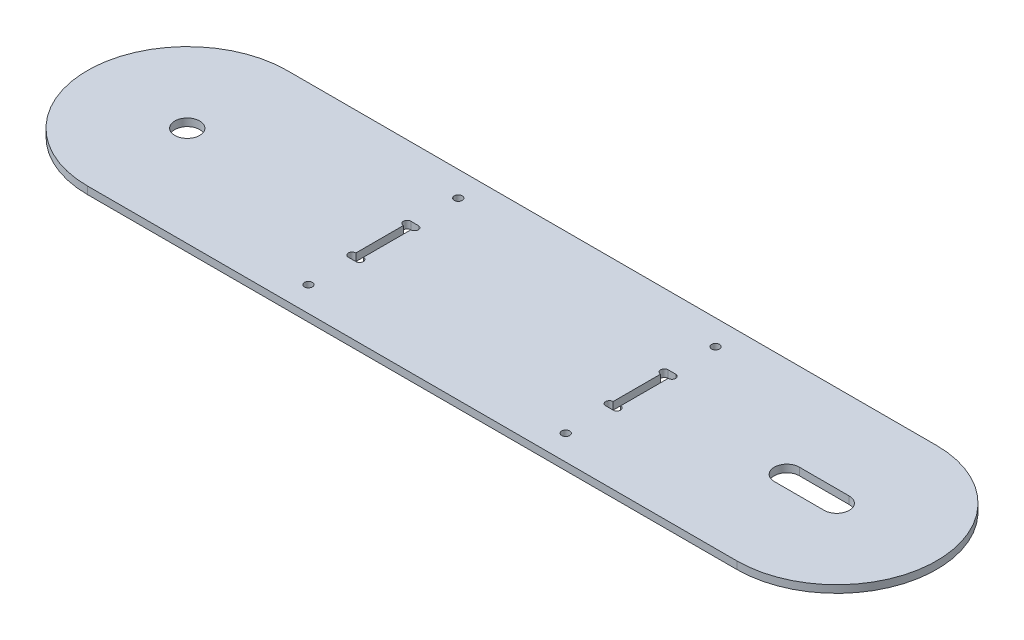
ISO-10303-21;
HEADER;
FILE_DESCRIPTION(('STEP AP214'),'2;1');
FILE_NAME('part.step','',(''),(''),'','','');
FILE_SCHEMA(('AUTOMOTIVE_DESIGN { 1 0 10303 214 1 1 1 1 }'));
ENDSEC;
DATA;
#1=APPLICATION_CONTEXT('core data for automotive mechanical design processes');
#2=APPLICATION_PROTOCOL_DEFINITION('international standard','automotive_design',2000,#1);
#3=PRODUCT_CONTEXT('',#1,'mechanical');
#4=PRODUCT('Part','Part','',(#3));
#5=PRODUCT_RELATED_PRODUCT_CATEGORY('part','',(#4));
#6=PRODUCT_DEFINITION_FORMATION('','',#4);
#7=PRODUCT_DEFINITION_CONTEXT('part definition',#1,'design');
#8=PRODUCT_DEFINITION('design','',#6,#7);
#9=PRODUCT_DEFINITION_SHAPE('','',#8);
#10=(LENGTH_UNIT() NAMED_UNIT(*) SI_UNIT(.MILLI.,.METRE.));
#11=(NAMED_UNIT(*) PLANE_ANGLE_UNIT() SI_UNIT($,.RADIAN.));
#12=(NAMED_UNIT(*) SI_UNIT($,.STERADIAN.) SOLID_ANGLE_UNIT());
#13=UNCERTAINTY_MEASURE_WITH_UNIT(LENGTH_MEASURE(1.E-05),#10,'distance_accuracy_value','');
#14=(GEOMETRIC_REPRESENTATION_CONTEXT(3) GLOBAL_UNCERTAINTY_ASSIGNED_CONTEXT((#13)) GLOBAL_UNIT_ASSIGNED_CONTEXT((#10,
#11,#12)) REPRESENTATION_CONTEXT('',''));
#15=CARTESIAN_POINT('',(0.,0.,0.));
#16=DIRECTION('',(0.,0.,1.));
#17=DIRECTION('',(1.,0.,0.));
#18=AXIS2_PLACEMENT_3D('',#15,#16,#17);
#19=CARTESIAN_POINT('',(0.,3.,0.));
#20=DIRECTION('',(0.,1.,0.));
#21=DIRECTION('',(0.,0.,1.));
#22=AXIS2_PLACEMENT_3D('',#19,#20,#21);
#23=PLANE('',#22);
#24=CARTESIAN_POINT('',(181.5,3.,-30.));
#25=DIRECTION('',(0.,1.,0.));
#26=DIRECTION('',(0.,0.,-1.));
#27=AXIS2_PLACEMENT_3D('',#24,#25,#26);
#28=CIRCLE('',#27,1.59999999999999);
#29=CARTESIAN_POINT('',(181.5,3.,-31.5999999999999));
#30=VERTEX_POINT('',#29);
#31=EDGE_CURVE('E277',#30,#30,#28,.T.);
#32=ORIENTED_EDGE('',*,*,#31,.F.);
#33=EDGE_LOOP('',(#32));
#34=FACE_BOUND('',#33,.T.);
#35=CARTESIAN_POINT('',(180.,3.,-11.));
#36=DIRECTION('',(0.,1.,0.));
#37=DIRECTION('',(0.,0.,-1.));
#38=AXIS2_PLACEMENT_3D('',#35,#36,#37);
#39=CIRCLE('',#38,1.5);
#40=CARTESIAN_POINT('',(180.,3.,-12.5));
#41=VERTEX_POINT('',#40);
#42=CARTESIAN_POINT('',(180.,3.,-9.5));
#43=VERTEX_POINT('',#42);
#44=EDGE_CURVE('E56',#41,#43,#39,.T.);
#45=ORIENTED_EDGE('',*,*,#44,.F.);
#46=DIRECTION('',(-1.,0.,0.));
#47=VECTOR('',#46,1.);
#48=CARTESIAN_POINT('',(183.,3.,-12.5));
#49=LINE('',#48,#47);
#50=CARTESIAN_POINT('',(183.,3.,-12.5));
#51=VERTEX_POINT('',#50);
#52=EDGE_CURVE('E278',#51,#41,#49,.T.);
#53=ORIENTED_EDGE('',*,*,#52,.F.);
#54=CARTESIAN_POINT('',(183.,3.,-11.));
#55=DIRECTION('',(0.,1.,0.));
#56=DIRECTION('',(0.,0.,-1.));
#57=AXIS2_PLACEMENT_3D('',#54,#55,#56);
#58=CIRCLE('',#57,1.5);
#59=CARTESIAN_POINT('',(183.,3.,-9.5));
#60=VERTEX_POINT('',#59);
#61=EDGE_CURVE('E281',#60,#51,#58,.T.);
#62=ORIENTED_EDGE('',*,*,#61,.F.);
#63=DIRECTION('',(0.,0.,-1.));
#64=VECTOR('',#63,1.);
#65=CARTESIAN_POINT('',(183.,3.,-9.5));
#66=LINE('',#65,#64);
#67=CARTESIAN_POINT('',(183.,3.,9.5));
#68=VERTEX_POINT('',#67);
#69=EDGE_CURVE('E285',#68,#60,#66,.T.);
#70=ORIENTED_EDGE('',*,*,#69,.F.);
#71=CARTESIAN_POINT('',(183.,3.,11.));
#72=DIRECTION('',(0.,1.,0.));
#73=DIRECTION('',(0.,0.,-1.));
#74=AXIS2_PLACEMENT_3D('',#71,#72,#73);
#75=CIRCLE('',#74,1.5);
#76=CARTESIAN_POINT('',(183.,3.,12.5));
#77=VERTEX_POINT('',#76);
#78=EDGE_CURVE('E288',#77,#68,#75,.T.);
#79=ORIENTED_EDGE('',*,*,#78,.F.);
#80=DIRECTION('',(1.,0.,0.));
#81=VECTOR('',#80,1.);
#82=CARTESIAN_POINT('',(183.,3.,12.5));
#83=LINE('',#82,#81);
#84=CARTESIAN_POINT('',(180.,3.,12.5));
#85=VERTEX_POINT('',#84);
#86=EDGE_CURVE('E291',#85,#77,#83,.T.);
#87=ORIENTED_EDGE('',*,*,#86,.F.);
#88=CARTESIAN_POINT('',(180.,3.,11.));
#89=DIRECTION('',(0.,1.,0.));
#90=DIRECTION('',(0.,0.,-1.));
#91=AXIS2_PLACEMENT_3D('',#88,#89,#90);
#92=CIRCLE('',#91,1.5);
#93=CARTESIAN_POINT('',(180.,3.,9.5));
#94=VERTEX_POINT('',#93);
#95=EDGE_CURVE('E294',#94,#85,#92,.T.);
#96=ORIENTED_EDGE('',*,*,#95,.F.);
#97=DIRECTION('',(0.,0.,1.));
#98=VECTOR('',#97,1.);
#99=CARTESIAN_POINT('',(180.,3.,-9.5));
#100=LINE('',#99,#98);
#101=EDGE_CURVE('E297',#43,#94,#100,.T.);
#102=ORIENTED_EDGE('',*,*,#101,.F.);
#103=EDGE_LOOP('',(#45,#53,#62,#70,#79,#87,#96,#102));
#104=FACE_BOUND('',#103,.T.);
#105=CARTESIAN_POINT('',(181.5,3.,30.));
#106=DIRECTION('',(0.,1.,0.));
#107=DIRECTION('',(0.,0.,-1.));
#108=AXIS2_PLACEMENT_3D('',#105,#106,#107);
#109=CIRCLE('',#108,1.59999999999999);
#110=CARTESIAN_POINT('',(181.5,3.,28.4));
#111=VERTEX_POINT('',#110);
#112=EDGE_CURVE('E209',#111,#111,#109,.T.);
#113=ORIENTED_EDGE('',*,*,#112,.F.);
#114=EDGE_LOOP('',(#113));
#115=FACE_BOUND('',#114,.T.);
#116=CARTESIAN_POINT('',(77.,3.,-11.));
#117=DIRECTION('',(0.,1.,0.));
#118=DIRECTION('',(0.,0.,1.));
#119=AXIS2_PLACEMENT_3D('',#116,#117,#118);
#120=CIRCLE('',#119,1.5);
#121=CARTESIAN_POINT('',(77.,3.,-12.5));
#122=VERTEX_POINT('',#121);
#123=CARTESIAN_POINT('',(77.,3.,-9.5));
#124=VERTEX_POINT('',#123);
#125=EDGE_CURVE('E64',#122,#124,#120,.T.);
#126=ORIENTED_EDGE('',*,*,#125,.F.);
#127=DIRECTION('',(-1.,0.,0.));
#128=VECTOR('',#127,1.);
#129=CARTESIAN_POINT('',(77.,3.,-12.5));
#130=LINE('',#129,#128);
#131=CARTESIAN_POINT('',(80.,3.,-12.5));
#132=VERTEX_POINT('',#131);
#133=EDGE_CURVE('E212',#132,#122,#130,.T.);
#134=ORIENTED_EDGE('',*,*,#133,.F.);
#135=CARTESIAN_POINT('',(80.,3.,-11.));
#136=DIRECTION('',(0.,1.,0.));
#137=DIRECTION('',(0.,0.,1.));
#138=AXIS2_PLACEMENT_3D('',#135,#136,#137);
#139=CIRCLE('',#138,1.5);
#140=CARTESIAN_POINT('',(80.,3.,-9.5));
#141=VERTEX_POINT('',#140);
#142=EDGE_CURVE('E217',#141,#132,#139,.T.);
#143=ORIENTED_EDGE('',*,*,#142,.F.);
#144=DIRECTION('',(0.,0.,-1.));
#145=VECTOR('',#144,1.);
#146=CARTESIAN_POINT('',(80.,3.,-9.5));
#147=LINE('',#146,#145);
#148=CARTESIAN_POINT('',(80.,3.,9.5));
#149=VERTEX_POINT('',#148);
#150=EDGE_CURVE('E820',#149,#141,#147,.T.);
#151=ORIENTED_EDGE('',*,*,#150,.F.);
#152=CARTESIAN_POINT('',(80.,3.,11.));
#153=DIRECTION('',(0.,1.,0.));
#154=DIRECTION('',(0.,0.,1.));
#155=AXIS2_PLACEMENT_3D('',#152,#153,#154);
#156=CIRCLE('',#155,1.5);
#157=CARTESIAN_POINT('',(80.,3.,12.5));
#158=VERTEX_POINT('',#157);
#159=EDGE_CURVE('E823',#158,#149,#156,.T.);
#160=ORIENTED_EDGE('',*,*,#159,.F.);
#161=DIRECTION('',(1.,0.,0.));
#162=VECTOR('',#161,1.);
#163=CARTESIAN_POINT('',(77.,3.,12.5));
#164=LINE('',#163,#162);
#165=CARTESIAN_POINT('',(77.,3.,12.5));
#166=VERTEX_POINT('',#165);
#167=EDGE_CURVE('E826',#166,#158,#164,.T.);
#168=ORIENTED_EDGE('',*,*,#167,.F.);
#169=CARTESIAN_POINT('',(77.,3.,11.));
#170=DIRECTION('',(0.,1.,0.));
#171=DIRECTION('',(0.,0.,1.));
#172=AXIS2_PLACEMENT_3D('',#169,#170,#171);
#173=CIRCLE('',#172,1.5);
#174=CARTESIAN_POINT('',(77.,3.,9.5));
#175=VERTEX_POINT('',#174);
#176=EDGE_CURVE('E229',#175,#166,#173,.T.);
#177=ORIENTED_EDGE('',*,*,#176,.F.);
#178=DIRECTION('',(0.,0.,1.));
#179=VECTOR('',#178,1.);
#180=CARTESIAN_POINT('',(77.,3.,-9.5));
#181=LINE('',#180,#179);
#182=EDGE_CURVE('E223',#124,#175,#181,.T.);
#183=ORIENTED_EDGE('',*,*,#182,.F.);
#184=EDGE_LOOP('',(#126,#134,#143,#151,#160,#168,#177,#183));
#185=FACE_BOUND('',#184,.T.);
#186=CARTESIAN_POINT('',(78.5,3.,30.));
#187=DIRECTION('',(0.,1.,0.));
#188=DIRECTION('',(0.,0.,1.));
#189=AXIS2_PLACEMENT_3D('',#186,#187,#188);
#190=CIRCLE('',#189,1.6);
#191=CARTESIAN_POINT('',(78.5,3.,31.6));
#192=VERTEX_POINT('',#191);
#193=EDGE_CURVE('E227',#192,#192,#190,.T.);
#194=ORIENTED_EDGE('',*,*,#193,.F.);
#195=EDGE_LOOP('',(#194));
#196=FACE_BOUND('',#195,.T.);
#197=CARTESIAN_POINT('',(78.5,3.,-30.));
#198=DIRECTION('',(0.,1.,0.));
#199=DIRECTION('',(0.,0.,1.));
#200=AXIS2_PLACEMENT_3D('',#197,#198,#199);
#201=CIRCLE('',#200,1.6);
#202=CARTESIAN_POINT('',(78.5,3.,-28.4));
#203=VERTEX_POINT('',#202);
#204=EDGE_CURVE('E332',#203,#203,#201,.T.);
#205=ORIENTED_EDGE('',*,*,#204,.F.);
#206=EDGE_LOOP('',(#205));
#207=FACE_BOUND('',#206,.T.);
#208=CARTESIAN_POINT('',(0.,3.,0.));
#209=DIRECTION('',(0.,1.,0.));
#210=DIRECTION('',(0.,0.,1.));
#211=AXIS2_PLACEMENT_3D('',#208,#209,#210);
#212=CIRCLE('',#211,40.);
#213=CARTESIAN_POINT('',(0.,3.,-40.));
#214=VERTEX_POINT('',#213);
#215=CARTESIAN_POINT('',(0.,3.,40.));
#216=VERTEX_POINT('',#215);
#217=EDGE_CURVE('E372',#214,#216,#212,.T.);
#218=ORIENTED_EDGE('',*,*,#217,.T.);
#219=DIRECTION('',(1.,0.,0.));
#220=VECTOR('',#219,1.);
#221=CARTESIAN_POINT('',(0.,3.,40.));
#222=LINE('',#221,#220);
#223=CARTESIAN_POINT('',(260.,3.,40.));
#224=VERTEX_POINT('',#223);
#225=EDGE_CURVE('E375',#216,#224,#222,.T.);
#226=ORIENTED_EDGE('',*,*,#225,.T.);
#227=CARTESIAN_POINT('',(260.,3.,0.));
#228=DIRECTION('',(0.,1.,0.));
#229=DIRECTION('',(0.,0.,1.));
#230=AXIS2_PLACEMENT_3D('',#227,#228,#229);
#231=CIRCLE('',#230,40.);
#232=CARTESIAN_POINT('',(260.,3.,-40.));
#233=VERTEX_POINT('',#232);
#234=EDGE_CURVE('E378',#224,#233,#231,.T.);
#235=ORIENTED_EDGE('',*,*,#234,.T.);
#236=DIRECTION('',(-1.,0.,0.));
#237=VECTOR('',#236,1.);
#238=CARTESIAN_POINT('',(0.,3.,-40.));
#239=LINE('',#238,#237);
#240=EDGE_CURVE('E380',#233,#214,#239,.T.);
#241=ORIENTED_EDGE('',*,*,#240,.T.);
#242=EDGE_LOOP('',(#218,#226,#235,#241));
#243=FACE_BOUND('',#242,.T.);
#244=CARTESIAN_POINT('',(0.,3.,0.));
#245=DIRECTION('',(0.,1.,0.));
#246=DIRECTION('',(0.,0.,1.));
#247=AXIS2_PLACEMENT_3D('',#244,#245,#246);
#248=CIRCLE('',#247,5.);
#249=CARTESIAN_POINT('',(0.,3.,5.));
#250=VERTEX_POINT('',#249);
#251=EDGE_CURVE('E366',#250,#250,#248,.T.);
#252=ORIENTED_EDGE('',*,*,#251,.F.);
#253=EDGE_LOOP('',(#252));
#254=FACE_BOUND('',#253,.T.);
#255=DIRECTION('',(-1.,0.,0.));
#256=VECTOR('',#255,1.);
#257=CARTESIAN_POINT('',(260.,3.,-5.));
#258=LINE('',#257,#256);
#259=CARTESIAN_POINT('',(260.,3.,-5.));
#260=VERTEX_POINT('',#259);
#261=CARTESIAN_POINT('',(240.,3.,-5.));
#262=VERTEX_POINT('',#261);
#263=EDGE_CURVE('E337',#260,#262,#258,.T.);
#264=ORIENTED_EDGE('',*,*,#263,.F.);
#265=CARTESIAN_POINT('',(260.,3.,0.));
#266=DIRECTION('',(0.,1.,0.));
#267=DIRECTION('',(0.,0.,1.));
#268=AXIS2_PLACEMENT_3D('',#265,#266,#267);
#269=CIRCLE('',#268,5.);
#270=CARTESIAN_POINT('',(260.,3.,5.));
#271=VERTEX_POINT('',#270);
#272=EDGE_CURVE('E335',#271,#260,#269,.T.);
#273=ORIENTED_EDGE('',*,*,#272,.F.);
#274=DIRECTION('',(1.,0.,0.));
#275=VECTOR('',#274,1.);
#276=CARTESIAN_POINT('',(260.,3.,5.));
#277=LINE('',#276,#275);
#278=CARTESIAN_POINT('',(240.,3.,5.));
#279=VERTEX_POINT('',#278);
#280=EDGE_CURVE('E343',#279,#271,#277,.T.);
#281=ORIENTED_EDGE('',*,*,#280,.F.);
#282=CARTESIAN_POINT('',(240.,3.,0.));
#283=DIRECTION('',(0.,1.,0.));
#284=DIRECTION('',(0.,0.,1.));
#285=AXIS2_PLACEMENT_3D('',#282,#283,#284);
#286=CIRCLE('',#285,5.);
#287=EDGE_CURVE('E340',#262,#279,#286,.T.);
#288=ORIENTED_EDGE('',*,*,#287,.F.);
#289=EDGE_LOOP('',(#264,#273,#281,#288));
#290=FACE_BOUND('',#289,.T.);
#291=ADVANCED_FACE('F41',(#34,#104,#115,#185,#196,#207,#243,#254,#290),#23,.T.);
#292=CARTESIAN_POINT('',(0.,0.,0.));
#293=DIRECTION('',(0.,1.,0.));
#294=DIRECTION('',(0.,0.,1.));
#295=AXIS2_PLACEMENT_3D('',#292,#293,#294);
#296=PLANE('',#295);
#297=CARTESIAN_POINT('',(181.5,0.,-30.));
#298=DIRECTION('',(0.,1.,0.));
#299=DIRECTION('',(0.,0.,-1.));
#300=AXIS2_PLACEMENT_3D('',#297,#298,#299);
#301=CIRCLE('',#300,1.59999999999999);
#302=CARTESIAN_POINT('',(181.5,0.,-31.5999999999999));
#303=VERTEX_POINT('',#302);
#304=EDGE_CURVE('E325',#303,#303,#301,.T.);
#305=ORIENTED_EDGE('',*,*,#304,.T.);
#306=EDGE_LOOP('',(#305));
#307=FACE_BOUND('',#306,.T.);
#308=DIRECTION('',(-1.,0.,0.));
#309=VECTOR('',#308,1.);
#310=CARTESIAN_POINT('',(183.,0.,-12.5));
#311=LINE('',#310,#309);
#312=CARTESIAN_POINT('',(183.,0.,-12.5));
#313=VERTEX_POINT('',#312);
#314=CARTESIAN_POINT('',(180.,0.,-12.5));
#315=VERTEX_POINT('',#314);
#316=EDGE_CURVE('E262',#313,#315,#311,.T.);
#317=ORIENTED_EDGE('',*,*,#316,.T.);
#318=CARTESIAN_POINT('',(180.,0.,-11.));
#319=DIRECTION('',(0.,1.,0.));
#320=DIRECTION('',(0.,0.,-1.));
#321=AXIS2_PLACEMENT_3D('',#318,#319,#320);
#322=CIRCLE('',#321,1.5);
#323=CARTESIAN_POINT('',(180.,0.,-9.5));
#324=VERTEX_POINT('',#323);
#325=EDGE_CURVE('E282',#315,#324,#322,.T.);
#326=ORIENTED_EDGE('',*,*,#325,.T.);
#327=DIRECTION('',(0.,0.,1.));
#328=VECTOR('',#327,1.);
#329=CARTESIAN_POINT('',(180.,0.,-9.5));
#330=LINE('',#329,#328);
#331=CARTESIAN_POINT('',(180.,0.,9.5));
#332=VERTEX_POINT('',#331);
#333=EDGE_CURVE('E318',#324,#332,#330,.T.);
#334=ORIENTED_EDGE('',*,*,#333,.T.);
#335=CARTESIAN_POINT('',(180.,0.,11.));
#336=DIRECTION('',(0.,1.,0.));
#337=DIRECTION('',(0.,0.,-1.));
#338=AXIS2_PLACEMENT_3D('',#335,#336,#337);
#339=CIRCLE('',#338,1.5);
#340=CARTESIAN_POINT('',(180.,0.,12.5));
#341=VERTEX_POINT('',#340);
#342=EDGE_CURVE('E315',#332,#341,#339,.T.);
#343=ORIENTED_EDGE('',*,*,#342,.T.);
#344=DIRECTION('',(1.,0.,0.));
#345=VECTOR('',#344,1.);
#346=CARTESIAN_POINT('',(183.,0.,12.5));
#347=LINE('',#346,#345);
#348=CARTESIAN_POINT('',(183.,0.,12.5));
#349=VERTEX_POINT('',#348);
#350=EDGE_CURVE('E312',#341,#349,#347,.T.);
#351=ORIENTED_EDGE('',*,*,#350,.T.);
#352=CARTESIAN_POINT('',(183.,0.,11.));
#353=DIRECTION('',(0.,1.,0.));
#354=DIRECTION('',(0.,0.,-1.));
#355=AXIS2_PLACEMENT_3D('',#352,#353,#354);
#356=CIRCLE('',#355,1.5);
#357=CARTESIAN_POINT('',(183.,0.,9.5));
#358=VERTEX_POINT('',#357);
#359=EDGE_CURVE('E309',#349,#358,#356,.T.);
#360=ORIENTED_EDGE('',*,*,#359,.T.);
#361=DIRECTION('',(0.,0.,-1.));
#362=VECTOR('',#361,1.);
#363=CARTESIAN_POINT('',(183.,0.,-9.5));
#364=LINE('',#363,#362);
#365=CARTESIAN_POINT('',(183.,0.,-9.5));
#366=VERTEX_POINT('',#365);
#367=EDGE_CURVE('E306',#358,#366,#364,.T.);
#368=ORIENTED_EDGE('',*,*,#367,.T.);
#369=CARTESIAN_POINT('',(183.,0.,-11.));
#370=DIRECTION('',(0.,1.,0.));
#371=DIRECTION('',(0.,0.,-1.));
#372=AXIS2_PLACEMENT_3D('',#369,#370,#371);
#373=CIRCLE('',#372,1.5);
#374=EDGE_CURVE('E303',#366,#313,#373,.T.);
#375=ORIENTED_EDGE('',*,*,#374,.T.);
#376=EDGE_LOOP('',(#317,#326,#334,#343,#351,#360,#368,#375));
#377=FACE_BOUND('',#376,.T.);
#378=CARTESIAN_POINT('',(181.5,0.,30.));
#379=DIRECTION('',(0.,1.,0.));
#380=DIRECTION('',(0.,0.,-1.));
#381=AXIS2_PLACEMENT_3D('',#378,#379,#380);
#382=CIRCLE('',#381,1.59999999999999);
#383=CARTESIAN_POINT('',(181.5,0.,28.4));
#384=VERTEX_POINT('',#383);
#385=EDGE_CURVE('E257',#384,#384,#382,.T.);
#386=ORIENTED_EDGE('',*,*,#385,.T.);
#387=EDGE_LOOP('',(#386));
#388=FACE_BOUND('',#387,.T.);
#389=DIRECTION('',(-1.,0.,0.));
#390=VECTOR('',#389,1.);
#391=CARTESIAN_POINT('',(77.,0.,-12.5));
#392=LINE('',#391,#390);
#393=CARTESIAN_POINT('',(80.,0.,-12.5));
#394=VERTEX_POINT('',#393);
#395=CARTESIAN_POINT('',(77.,0.,-12.5));
#396=VERTEX_POINT('',#395);
#397=EDGE_CURVE('E233',#394,#396,#392,.T.);
#398=ORIENTED_EDGE('',*,*,#397,.T.);
#399=CARTESIAN_POINT('',(77.,0.,-11.));
#400=DIRECTION('',(0.,1.,0.));
#401=DIRECTION('',(0.,0.,1.));
#402=AXIS2_PLACEMENT_3D('',#399,#400,#401);
#403=CIRCLE('',#402,1.5);
#404=CARTESIAN_POINT('',(77.,0.,-9.5));
#405=VERTEX_POINT('',#404);
#406=EDGE_CURVE('E204',#396,#405,#403,.T.);
#407=ORIENTED_EDGE('',*,*,#406,.T.);
#408=DIRECTION('',(0.,0.,1.));
#409=VECTOR('',#408,1.);
#410=CARTESIAN_POINT('',(77.,0.,-9.5));
#411=LINE('',#410,#409);
#412=CARTESIAN_POINT('',(77.,0.,9.5));
#413=VERTEX_POINT('',#412);
#414=EDGE_CURVE('E251',#405,#413,#411,.T.);
#415=ORIENTED_EDGE('',*,*,#414,.T.);
#416=CARTESIAN_POINT('',(77.,0.,11.));
#417=DIRECTION('',(0.,1.,0.));
#418=DIRECTION('',(0.,0.,1.));
#419=AXIS2_PLACEMENT_3D('',#416,#417,#418);
#420=CIRCLE('',#419,1.5);
#421=CARTESIAN_POINT('',(77.,0.,12.5));
#422=VERTEX_POINT('',#421);
#423=EDGE_CURVE('E248',#413,#422,#420,.T.);
#424=ORIENTED_EDGE('',*,*,#423,.T.);
#425=DIRECTION('',(1.,0.,0.));
#426=VECTOR('',#425,1.);
#427=CARTESIAN_POINT('',(77.,0.,12.5));
#428=LINE('',#427,#426);
#429=CARTESIAN_POINT('',(80.,0.,12.5));
#430=VERTEX_POINT('',#429);
#431=EDGE_CURVE('E245',#422,#430,#428,.T.);
#432=ORIENTED_EDGE('',*,*,#431,.T.);
#433=CARTESIAN_POINT('',(80.,0.,11.));
#434=DIRECTION('',(0.,1.,0.));
#435=DIRECTION('',(0.,0.,1.));
#436=AXIS2_PLACEMENT_3D('',#433,#434,#435);
#437=CIRCLE('',#436,1.5);
#438=CARTESIAN_POINT('',(80.,0.,9.5));
#439=VERTEX_POINT('',#438);
#440=EDGE_CURVE('E242',#430,#439,#437,.T.);
#441=ORIENTED_EDGE('',*,*,#440,.T.);
#442=DIRECTION('',(0.,0.,-1.));
#443=VECTOR('',#442,1.);
#444=CARTESIAN_POINT('',(80.,0.,-9.5));
#445=LINE('',#444,#443);
#446=CARTESIAN_POINT('',(80.,0.,-9.5));
#447=VERTEX_POINT('',#446);
#448=EDGE_CURVE('E239',#439,#447,#445,.T.);
#449=ORIENTED_EDGE('',*,*,#448,.T.);
#450=CARTESIAN_POINT('',(80.,0.,-11.));
#451=DIRECTION('',(0.,1.,0.));
#452=DIRECTION('',(0.,0.,1.));
#453=AXIS2_PLACEMENT_3D('',#450,#451,#452);
#454=CIRCLE('',#453,1.5);
#455=EDGE_CURVE('E235',#447,#394,#454,.T.);
#456=ORIENTED_EDGE('',*,*,#455,.T.);
#457=EDGE_LOOP('',(#398,#407,#415,#424,#432,#441,#449,#456));
#458=FACE_BOUND('',#457,.T.);
#459=CARTESIAN_POINT('',(78.5,0.,30.));
#460=DIRECTION('',(0.,1.,0.));
#461=DIRECTION('',(0.,0.,1.));
#462=AXIS2_PLACEMENT_3D('',#459,#460,#461);
#463=CIRCLE('',#462,1.6);
#464=CARTESIAN_POINT('',(78.5,0.,31.6));
#465=VERTEX_POINT('',#464);
#466=EDGE_CURVE('E224',#465,#465,#463,.T.);
#467=ORIENTED_EDGE('',*,*,#466,.T.);
#468=EDGE_LOOP('',(#467));
#469=FACE_BOUND('',#468,.T.);
#470=CARTESIAN_POINT('',(78.5,0.,-30.));
#471=DIRECTION('',(0.,1.,0.));
#472=DIRECTION('',(0.,0.,1.));
#473=AXIS2_PLACEMENT_3D('',#470,#471,#472);
#474=CIRCLE('',#473,1.6);
#475=CARTESIAN_POINT('',(78.5,0.,-28.4));
#476=VERTEX_POINT('',#475);
#477=EDGE_CURVE('E328',#476,#476,#474,.T.);
#478=ORIENTED_EDGE('',*,*,#477,.T.);
#479=EDGE_LOOP('',(#478));
#480=FACE_BOUND('',#479,.T.);
#481=CARTESIAN_POINT('',(0.,0.,0.));
#482=DIRECTION('',(0.,1.,0.));
#483=DIRECTION('',(0.,0.,1.));
#484=AXIS2_PLACEMENT_3D('',#481,#482,#483);
#485=CIRCLE('',#484,5.);
#486=CARTESIAN_POINT('',(0.,0.,5.));
#487=VERTEX_POINT('',#486);
#488=EDGE_CURVE('E365',#487,#487,#485,.T.);
#489=ORIENTED_EDGE('',*,*,#488,.T.);
#490=EDGE_LOOP('',(#489));
#491=FACE_BOUND('',#490,.T.);
#492=CARTESIAN_POINT('',(0.,0.,0.));
#493=DIRECTION('',(0.,1.,0.));
#494=DIRECTION('',(0.,0.,1.));
#495=AXIS2_PLACEMENT_3D('',#492,#493,#494);
#496=CIRCLE('',#495,40.);
#497=CARTESIAN_POINT('',(0.,0.,-40.));
#498=VERTEX_POINT('',#497);
#499=CARTESIAN_POINT('',(0.,0.,40.));
#500=VERTEX_POINT('',#499);
#501=EDGE_CURVE('E369',#498,#500,#496,.T.);
#502=ORIENTED_EDGE('',*,*,#501,.F.);
#503=DIRECTION('',(-1.,0.,0.));
#504=VECTOR('',#503,1.);
#505=CARTESIAN_POINT('',(0.,0.,-40.));
#506=LINE('',#505,#504);
#507=CARTESIAN_POINT('',(260.,0.,-40.));
#508=VERTEX_POINT('',#507);
#509=EDGE_CURVE('E376',#508,#498,#506,.T.);
#510=ORIENTED_EDGE('',*,*,#509,.F.);
#511=CARTESIAN_POINT('',(260.,0.,0.));
#512=DIRECTION('',(0.,1.,0.));
#513=DIRECTION('',(0.,0.,1.));
#514=AXIS2_PLACEMENT_3D('',#511,#512,#513);
#515=CIRCLE('',#514,40.);
#516=CARTESIAN_POINT('',(260.,0.,40.));
#517=VERTEX_POINT('',#516);
#518=EDGE_CURVE('E387',#517,#508,#515,.T.);
#519=ORIENTED_EDGE('',*,*,#518,.F.);
#520=DIRECTION('',(1.,0.,0.));
#521=VECTOR('',#520,1.);
#522=CARTESIAN_POINT('',(0.,0.,40.));
#523=LINE('',#522,#521);
#524=EDGE_CURVE('E385',#500,#517,#523,.T.);
#525=ORIENTED_EDGE('',*,*,#524,.F.);
#526=EDGE_LOOP('',(#502,#510,#519,#525));
#527=FACE_BOUND('',#526,.T.);
#528=CARTESIAN_POINT('',(260.,0.,0.));
#529=DIRECTION('',(0.,1.,0.));
#530=DIRECTION('',(0.,0.,1.));
#531=AXIS2_PLACEMENT_3D('',#528,#529,#530);
#532=CIRCLE('',#531,5.);
#533=CARTESIAN_POINT('',(260.,0.,5.));
#534=VERTEX_POINT('',#533);
#535=CARTESIAN_POINT('',(260.,0.,-5.));
#536=VERTEX_POINT('',#535);
#537=EDGE_CURVE('E331',#534,#536,#532,.T.);
#538=ORIENTED_EDGE('',*,*,#537,.T.);
#539=DIRECTION('',(-1.,0.,0.));
#540=VECTOR('',#539,1.);
#541=CARTESIAN_POINT('',(260.,0.,-5.));
#542=LINE('',#541,#540);
#543=CARTESIAN_POINT('',(240.,0.,-5.));
#544=VERTEX_POINT('',#543);
#545=EDGE_CURVE('E348',#536,#544,#542,.T.);
#546=ORIENTED_EDGE('',*,*,#545,.T.);
#547=CARTESIAN_POINT('',(240.,0.,0.));
#548=DIRECTION('',(0.,1.,0.));
#549=DIRECTION('',(0.,0.,1.));
#550=AXIS2_PLACEMENT_3D('',#547,#548,#549);
#551=CIRCLE('',#550,5.);
#552=CARTESIAN_POINT('',(240.,0.,5.));
#553=VERTEX_POINT('',#552);
#554=EDGE_CURVE('E351',#544,#553,#551,.T.);
#555=ORIENTED_EDGE('',*,*,#554,.T.);
#556=DIRECTION('',(1.,0.,0.));
#557=VECTOR('',#556,1.);
#558=CARTESIAN_POINT('',(260.,0.,5.));
#559=LINE('',#558,#557);
#560=EDGE_CURVE('E338',#553,#534,#559,.T.);
#561=ORIENTED_EDGE('',*,*,#560,.T.);
#562=EDGE_LOOP('',(#538,#546,#555,#561));
#563=FACE_BOUND('',#562,.T.);
#564=ADVANCED_FACE('F405',(#307,#377,#388,#458,#469,#480,#491,#527,#563),#296,.F.);
#565=CARTESIAN_POINT('',(0.,3.,0.));
#566=DIRECTION('',(0.,-1.,0.));
#567=DIRECTION('',(0.,0.,-1.));
#568=AXIS2_PLACEMENT_3D('',#565,#566,#567);
#569=CYLINDRICAL_SURFACE('',#568,40.);
#570=ORIENTED_EDGE('',*,*,#501,.T.);
#571=DIRECTION('',(0.,-1.,0.));
#572=VECTOR('',#571,1.);
#573=CARTESIAN_POINT('',(0.,3.,40.));
#574=LINE('',#573,#572);
#575=EDGE_CURVE('E11',#216,#500,#574,.T.);
#576=ORIENTED_EDGE('',*,*,#575,.F.);
#577=ORIENTED_EDGE('',*,*,#217,.F.);
#578=DIRECTION('',(0.,-1.,0.));
#579=VECTOR('',#578,1.);
#580=CARTESIAN_POINT('',(0.,3.,-40.));
#581=LINE('',#580,#579);
#582=EDGE_CURVE('E382',#214,#498,#581,.T.);
#583=ORIENTED_EDGE('',*,*,#582,.T.);
#584=EDGE_LOOP('',(#570,#576,#577,#583));
#585=FACE_BOUND('',#584,.T.);
#586=ADVANCED_FACE('F43',(#585),#569,.T.);
#587=CARTESIAN_POINT('',(0.,3.,40.));
#588=DIRECTION('',(0.,0.,-1.));
#589=DIRECTION('',(-1.,0.,0.));
#590=AXIS2_PLACEMENT_3D('',#587,#588,#589);
#591=PLANE('',#590);
#592=ORIENTED_EDGE('',*,*,#524,.T.);
#593=DIRECTION('',(0.,-1.,0.));
#594=VECTOR('',#593,1.);
#595=CARTESIAN_POINT('',(260.,3.,40.));
#596=LINE('',#595,#594);
#597=EDGE_CURVE('E49',#224,#517,#596,.T.);
#598=ORIENTED_EDGE('',*,*,#597,.F.);
#599=ORIENTED_EDGE('',*,*,#225,.F.);
#600=ORIENTED_EDGE('',*,*,#575,.T.);
#601=EDGE_LOOP('',(#592,#598,#599,#600));
#602=FACE_BOUND('',#601,.T.);
#603=ADVANCED_FACE('F416',(#602),#591,.F.);
#604=CARTESIAN_POINT('',(260.,3.,0.));
#605=DIRECTION('',(0.,-1.,0.));
#606=DIRECTION('',(0.,0.,-1.));
#607=AXIS2_PLACEMENT_3D('',#604,#605,#606);
#608=CYLINDRICAL_SURFACE('',#607,40.);
#609=ORIENTED_EDGE('',*,*,#518,.T.);
#610=DIRECTION('',(0.,-1.,0.));
#611=VECTOR('',#610,1.);
#612=CARTESIAN_POINT('',(260.,3.,-40.));
#613=LINE('',#612,#611);
#614=EDGE_CURVE('E392',#233,#508,#613,.T.);
#615=ORIENTED_EDGE('',*,*,#614,.F.);
#616=ORIENTED_EDGE('',*,*,#234,.F.);
#617=ORIENTED_EDGE('',*,*,#597,.T.);
#618=EDGE_LOOP('',(#609,#615,#616,#617));
#619=FACE_BOUND('',#618,.T.);
#620=ADVANCED_FACE('F399',(#619),#608,.T.);
#621=CARTESIAN_POINT('',(0.,3.,-40.));
#622=DIRECTION('',(0.,0.,1.));
#623=DIRECTION('',(1.,0.,0.));
#624=AXIS2_PLACEMENT_3D('',#621,#622,#623);
#625=PLANE('',#624);
#626=ORIENTED_EDGE('',*,*,#509,.T.);
#627=ORIENTED_EDGE('',*,*,#582,.F.);
#628=ORIENTED_EDGE('',*,*,#240,.F.);
#629=ORIENTED_EDGE('',*,*,#614,.T.);
#630=EDGE_LOOP('',(#626,#627,#628,#629));
#631=FACE_BOUND('',#630,.T.);
#632=ADVANCED_FACE('F409',(#631),#625,.F.);
#633=CARTESIAN_POINT('',(0.,3.,0.));
#634=DIRECTION('',(0.,-1.,0.));
#635=DIRECTION('',(0.,0.,-1.));
#636=AXIS2_PLACEMENT_3D('',#633,#634,#635);
#637=CYLINDRICAL_SURFACE('',#636,5.);
#638=ORIENTED_EDGE('',*,*,#251,.T.);
#639=EDGE_LOOP('',(#638));
#640=FACE_BOUND('',#639,.T.);
#641=ORIENTED_EDGE('',*,*,#488,.F.);
#642=EDGE_LOOP('',(#641));
#643=FACE_BOUND('',#642,.T.);
#644=ADVANCED_FACE('F434',(#640,#643),#637,.F.);
#645=CARTESIAN_POINT('',(260.,3.,0.));
#646=DIRECTION('',(0.,-1.,0.));
#647=DIRECTION('',(0.,0.,-1.));
#648=AXIS2_PLACEMENT_3D('',#645,#646,#647);
#649=CYLINDRICAL_SURFACE('',#648,5.);
#650=ORIENTED_EDGE('',*,*,#537,.F.);
#651=DIRECTION('',(0.,-1.,0.));
#652=VECTOR('',#651,1.);
#653=CARTESIAN_POINT('',(260.,3.,5.));
#654=LINE('',#653,#652);
#655=EDGE_CURVE('E345',#271,#534,#654,.T.);
#656=ORIENTED_EDGE('',*,*,#655,.F.);
#657=ORIENTED_EDGE('',*,*,#272,.T.);
#658=DIRECTION('',(0.,-1.,0.));
#659=VECTOR('',#658,1.);
#660=CARTESIAN_POINT('',(260.,3.,-5.));
#661=LINE('',#660,#659);
#662=EDGE_CURVE('E362',#260,#536,#661,.T.);
#663=ORIENTED_EDGE('',*,*,#662,.T.);
#664=EDGE_LOOP('',(#650,#656,#657,#663));
#665=FACE_BOUND('',#664,.T.);
#666=ADVANCED_FACE('F441',(#665),#649,.F.);
#667=CARTESIAN_POINT('',(260.,3.,-5.));
#668=DIRECTION('',(0.,0.,1.));
#669=DIRECTION('',(1.,0.,0.));
#670=AXIS2_PLACEMENT_3D('',#667,#668,#669);
#671=PLANE('',#670);
#672=ORIENTED_EDGE('',*,*,#545,.F.);
#673=ORIENTED_EDGE('',*,*,#662,.F.);
#674=ORIENTED_EDGE('',*,*,#263,.T.);
#675=DIRECTION('',(0.,-1.,0.));
#676=VECTOR('',#675,1.);
#677=CARTESIAN_POINT('',(240.,3.,-5.));
#678=LINE('',#677,#676);
#679=EDGE_CURVE('E360',#262,#544,#678,.T.);
#680=ORIENTED_EDGE('',*,*,#679,.T.);
#681=EDGE_LOOP('',(#672,#673,#674,#680));
#682=FACE_BOUND('',#681,.T.);
#683=ADVANCED_FACE('F446',(#682),#671,.T.);
#684=CARTESIAN_POINT('',(240.,3.,0.));
#685=DIRECTION('',(0.,-1.,0.));
#686=DIRECTION('',(0.,0.,-1.));
#687=AXIS2_PLACEMENT_3D('',#684,#685,#686);
#688=CYLINDRICAL_SURFACE('',#687,5.);
#689=ORIENTED_EDGE('',*,*,#554,.F.);
#690=ORIENTED_EDGE('',*,*,#679,.F.);
#691=ORIENTED_EDGE('',*,*,#287,.T.);
#692=DIRECTION('',(0.,-1.,0.));
#693=VECTOR('',#692,1.);
#694=CARTESIAN_POINT('',(240.,3.,5.));
#695=LINE('',#694,#693);
#696=EDGE_CURVE('E358',#279,#553,#695,.T.);
#697=ORIENTED_EDGE('',*,*,#696,.T.);
#698=EDGE_LOOP('',(#689,#690,#691,#697));
#699=FACE_BOUND('',#698,.T.);
#700=ADVANCED_FACE('F462',(#699),#688,.F.);
#701=CARTESIAN_POINT('',(260.,3.,5.));
#702=DIRECTION('',(0.,0.,-1.));
#703=DIRECTION('',(-1.,0.,0.));
#704=AXIS2_PLACEMENT_3D('',#701,#702,#703);
#705=PLANE('',#704);
#706=ORIENTED_EDGE('',*,*,#560,.F.);
#707=ORIENTED_EDGE('',*,*,#696,.F.);
#708=ORIENTED_EDGE('',*,*,#280,.T.);
#709=ORIENTED_EDGE('',*,*,#655,.T.);
#710=EDGE_LOOP('',(#706,#707,#708,#709));
#711=FACE_BOUND('',#710,.T.);
#712=ADVANCED_FACE('F466',(#711),#705,.T.);
#713=CARTESIAN_POINT('',(78.5,0.,-30.));
#714=DIRECTION('',(0.,1.,0.));
#715=DIRECTION('',(0.,0.,1.));
#716=AXIS2_PLACEMENT_3D('',#713,#714,#715);
#717=CYLINDRICAL_SURFACE('',#716,1.6);
#718=ORIENTED_EDGE('',*,*,#477,.F.);
#719=EDGE_LOOP('',(#718));
#720=FACE_BOUND('',#719,.T.);
#721=ORIENTED_EDGE('',*,*,#204,.T.);
#722=EDGE_LOOP('',(#721));
#723=FACE_BOUND('',#722,.T.);
#724=ADVANCED_FACE('F468',(#720,#723),#717,.F.);
#725=CARTESIAN_POINT('',(78.5,0.,30.));
#726=DIRECTION('',(0.,1.,0.));
#727=DIRECTION('',(0.,0.,1.));
#728=AXIS2_PLACEMENT_3D('',#725,#726,#727);
#729=CYLINDRICAL_SURFACE('',#728,1.6);
#730=ORIENTED_EDGE('',*,*,#466,.F.);
#731=EDGE_LOOP('',(#730));
#732=FACE_BOUND('',#731,.T.);
#733=ORIENTED_EDGE('',*,*,#193,.T.);
#734=EDGE_LOOP('',(#733));
#735=FACE_BOUND('',#734,.T.);
#736=ADVANCED_FACE('F474',(#732,#735),#729,.F.);
#737=CARTESIAN_POINT('',(77.,0.,-11.));
#738=DIRECTION('',(0.,1.,0.));
#739=DIRECTION('',(0.,0.,1.));
#740=AXIS2_PLACEMENT_3D('',#737,#738,#739);
#741=CYLINDRICAL_SURFACE('',#740,1.5);
#742=ORIENTED_EDGE('',*,*,#125,.T.);
#743=DIRECTION('',(0.,1.,0.));
#744=VECTOR('',#743,1.);
#745=CARTESIAN_POINT('',(77.,0.,-9.5));
#746=LINE('',#745,#744);
#747=EDGE_CURVE('E236',#405,#124,#746,.T.);
#748=ORIENTED_EDGE('',*,*,#747,.F.);
#749=ORIENTED_EDGE('',*,*,#406,.F.);
#750=DIRECTION('',(0.,1.,0.));
#751=VECTOR('',#750,1.);
#752=CARTESIAN_POINT('',(77.,0.,-12.5));
#753=LINE('',#752,#751);
#754=EDGE_CURVE('E200',#396,#122,#753,.T.);
#755=ORIENTED_EDGE('',*,*,#754,.T.);
#756=EDGE_LOOP('',(#742,#748,#749,#755));
#757=FACE_BOUND('',#756,.T.);
#758=ADVANCED_FACE('F202',(#757),#741,.F.);
#759=CARTESIAN_POINT('',(77.,0.,-12.5));
#760=DIRECTION('',(0.,0.,-1.));
#761=DIRECTION('',(-1.,0.,0.));
#762=AXIS2_PLACEMENT_3D('',#759,#760,#761);
#763=PLANE('',#762);
#764=ORIENTED_EDGE('',*,*,#133,.T.);
#765=ORIENTED_EDGE('',*,*,#754,.F.);
#766=ORIENTED_EDGE('',*,*,#397,.F.);
#767=DIRECTION('',(0.,1.,0.));
#768=VECTOR('',#767,1.);
#769=CARTESIAN_POINT('',(80.,0.,-12.5));
#770=LINE('',#769,#768);
#771=EDGE_CURVE('E208',#394,#132,#770,.T.);
#772=ORIENTED_EDGE('',*,*,#771,.T.);
#773=EDGE_LOOP('',(#764,#765,#766,#772));
#774=FACE_BOUND('',#773,.T.);
#775=ADVANCED_FACE('F213',(#774),#763,.F.);
#776=CARTESIAN_POINT('',(80.,0.,-11.));
#777=DIRECTION('',(0.,1.,0.));
#778=DIRECTION('',(0.,0.,1.));
#779=AXIS2_PLACEMENT_3D('',#776,#777,#778);
#780=CYLINDRICAL_SURFACE('',#779,1.5);
#781=ORIENTED_EDGE('',*,*,#142,.T.);
#782=ORIENTED_EDGE('',*,*,#771,.F.);
#783=ORIENTED_EDGE('',*,*,#455,.F.);
#784=DIRECTION('',(0.,1.,0.));
#785=VECTOR('',#784,1.);
#786=CARTESIAN_POINT('',(80.,0.,-9.5));
#787=LINE('',#786,#785);
#788=EDGE_CURVE('E816',#447,#141,#787,.T.);
#789=ORIENTED_EDGE('',*,*,#788,.T.);
#790=EDGE_LOOP('',(#781,#782,#783,#789));
#791=FACE_BOUND('',#790,.T.);
#792=ADVANCED_FACE('F543',(#791),#780,.F.);
#793=CARTESIAN_POINT('',(80.,0.,-9.5));
#794=DIRECTION('',(1.,0.,0.));
#795=DIRECTION('',(0.,0.,-1.));
#796=AXIS2_PLACEMENT_3D('',#793,#794,#795);
#797=PLANE('',#796);
#798=ORIENTED_EDGE('',*,*,#150,.T.);
#799=ORIENTED_EDGE('',*,*,#788,.F.);
#800=ORIENTED_EDGE('',*,*,#448,.F.);
#801=DIRECTION('',(0.,1.,0.));
#802=VECTOR('',#801,1.);
#803=CARTESIAN_POINT('',(80.,0.,9.5));
#804=LINE('',#803,#802);
#805=EDGE_CURVE('E814',#439,#149,#804,.T.);
#806=ORIENTED_EDGE('',*,*,#805,.T.);
#807=EDGE_LOOP('',(#798,#799,#800,#806));
#808=FACE_BOUND('',#807,.T.);
#809=ADVANCED_FACE('F553',(#808),#797,.F.);
#810=CARTESIAN_POINT('',(80.,0.,11.));
#811=DIRECTION('',(0.,1.,0.));
#812=DIRECTION('',(0.,0.,1.));
#813=AXIS2_PLACEMENT_3D('',#810,#811,#812);
#814=CYLINDRICAL_SURFACE('',#813,1.5);
#815=ORIENTED_EDGE('',*,*,#159,.T.);
#816=ORIENTED_EDGE('',*,*,#805,.F.);
#817=ORIENTED_EDGE('',*,*,#440,.F.);
#818=DIRECTION('',(0.,1.,0.));
#819=VECTOR('',#818,1.);
#820=CARTESIAN_POINT('',(80.,0.,12.5));
#821=LINE('',#820,#819);
#822=EDGE_CURVE('E812',#430,#158,#821,.T.);
#823=ORIENTED_EDGE('',*,*,#822,.T.);
#824=EDGE_LOOP('',(#815,#816,#817,#823));
#825=FACE_BOUND('',#824,.T.);
#826=ADVANCED_FACE('F564',(#825),#814,.F.);
#827=CARTESIAN_POINT('',(77.,0.,12.5));
#828=DIRECTION('',(0.,0.,1.));
#829=DIRECTION('',(1.,0.,0.));
#830=AXIS2_PLACEMENT_3D('',#827,#828,#829);
#831=PLANE('',#830);
#832=ORIENTED_EDGE('',*,*,#167,.T.);
#833=ORIENTED_EDGE('',*,*,#822,.F.);
#834=ORIENTED_EDGE('',*,*,#431,.F.);
#835=DIRECTION('',(0.,1.,0.));
#836=VECTOR('',#835,1.);
#837=CARTESIAN_POINT('',(77.,0.,12.5));
#838=LINE('',#837,#836);
#839=EDGE_CURVE('E810',#422,#166,#838,.T.);
#840=ORIENTED_EDGE('',*,*,#839,.T.);
#841=EDGE_LOOP('',(#832,#833,#834,#840));
#842=FACE_BOUND('',#841,.T.);
#843=ADVANCED_FACE('F575',(#842),#831,.F.);
#844=CARTESIAN_POINT('',(77.,0.,11.));
#845=DIRECTION('',(0.,1.,0.));
#846=DIRECTION('',(0.,0.,1.));
#847=AXIS2_PLACEMENT_3D('',#844,#845,#846);
#848=CYLINDRICAL_SURFACE('',#847,1.5);
#849=ORIENTED_EDGE('',*,*,#176,.T.);
#850=ORIENTED_EDGE('',*,*,#839,.F.);
#851=ORIENTED_EDGE('',*,*,#423,.F.);
#852=DIRECTION('',(0.,1.,0.));
#853=VECTOR('',#852,1.);
#854=CARTESIAN_POINT('',(77.,0.,9.5));
#855=LINE('',#854,#853);
#856=EDGE_CURVE('E808',#413,#175,#855,.T.);
#857=ORIENTED_EDGE('',*,*,#856,.T.);
#858=EDGE_LOOP('',(#849,#850,#851,#857));
#859=FACE_BOUND('',#858,.T.);
#860=ADVANCED_FACE('F586',(#859),#848,.F.);
#861=CARTESIAN_POINT('',(77.,0.,-9.5));
#862=DIRECTION('',(-1.,0.,0.));
#863=DIRECTION('',(0.,0.,1.));
#864=AXIS2_PLACEMENT_3D('',#861,#862,#863);
#865=PLANE('',#864);
#866=ORIENTED_EDGE('',*,*,#182,.T.);
#867=ORIENTED_EDGE('',*,*,#856,.F.);
#868=ORIENTED_EDGE('',*,*,#414,.F.);
#869=ORIENTED_EDGE('',*,*,#747,.T.);
#870=EDGE_LOOP('',(#866,#867,#868,#869));
#871=FACE_BOUND('',#870,.T.);
#872=ADVANCED_FACE('F597',(#871),#865,.F.);
#873=CARTESIAN_POINT('',(181.5,0.,30.));
#874=DIRECTION('',(0.,1.,0.));
#875=DIRECTION('',(0.,0.,1.));
#876=AXIS2_PLACEMENT_3D('',#873,#874,#875);
#877=CYLINDRICAL_SURFACE('',#876,1.59999999999999);
#878=ORIENTED_EDGE('',*,*,#385,.F.);
#879=EDGE_LOOP('',(#878));
#880=FACE_BOUND('',#879,.T.);
#881=ORIENTED_EDGE('',*,*,#112,.T.);
#882=EDGE_LOOP('',(#881));
#883=FACE_BOUND('',#882,.T.);
#884=ADVANCED_FACE('F608',(#880,#883),#877,.F.);
#885=CARTESIAN_POINT('',(180.,0.,-11.));
#886=DIRECTION('',(0.,1.,0.));
#887=DIRECTION('',(0.,0.,1.));
#888=AXIS2_PLACEMENT_3D('',#885,#886,#887);
#889=CYLINDRICAL_SURFACE('',#888,1.5);
#890=ORIENTED_EDGE('',*,*,#44,.T.);
#891=DIRECTION('',(0.,1.,0.));
#892=VECTOR('',#891,1.);
#893=CARTESIAN_POINT('',(180.,0.,-9.5));
#894=LINE('',#893,#892);
#895=EDGE_CURVE('E260',#324,#43,#894,.T.);
#896=ORIENTED_EDGE('',*,*,#895,.F.);
#897=ORIENTED_EDGE('',*,*,#325,.F.);
#898=DIRECTION('',(0.,1.,0.));
#899=VECTOR('',#898,1.);
#900=CARTESIAN_POINT('',(180.,0.,-12.5));
#901=LINE('',#900,#899);
#902=EDGE_CURVE('E275',#315,#41,#901,.T.);
#903=ORIENTED_EDGE('',*,*,#902,.T.);
#904=EDGE_LOOP('',(#890,#896,#897,#903));
#905=FACE_BOUND('',#904,.T.);
#906=ADVANCED_FACE('F619',(#905),#889,.F.);
#907=CARTESIAN_POINT('',(183.,0.,-12.5));
#908=DIRECTION('',(0.,0.,-1.));
#909=DIRECTION('',(-1.,0.,0.));
#910=AXIS2_PLACEMENT_3D('',#907,#908,#909);
#911=PLANE('',#910);
#912=ORIENTED_EDGE('',*,*,#52,.T.);
#913=ORIENTED_EDGE('',*,*,#902,.F.);
#914=ORIENTED_EDGE('',*,*,#316,.F.);
#915=DIRECTION('',(0.,1.,0.));
#916=VECTOR('',#915,1.);
#917=CARTESIAN_POINT('',(183.,0.,-12.5));
#918=LINE('',#917,#916);
#919=EDGE_CURVE('E273',#313,#51,#918,.T.);
#920=ORIENTED_EDGE('',*,*,#919,.T.);
#921=EDGE_LOOP('',(#912,#913,#914,#920));
#922=FACE_BOUND('',#921,.T.);
#923=ADVANCED_FACE('F630',(#922),#911,.F.);
#924=CARTESIAN_POINT('',(183.,0.,-11.));
#925=DIRECTION('',(0.,1.,0.));
#926=DIRECTION('',(0.,0.,1.));
#927=AXIS2_PLACEMENT_3D('',#924,#925,#926);
#928=CYLINDRICAL_SURFACE('',#927,1.5);
#929=ORIENTED_EDGE('',*,*,#61,.T.);
#930=ORIENTED_EDGE('',*,*,#919,.F.);
#931=ORIENTED_EDGE('',*,*,#374,.F.);
#932=DIRECTION('',(0.,1.,0.));
#933=VECTOR('',#932,1.);
#934=CARTESIAN_POINT('',(183.,0.,-9.5));
#935=LINE('',#934,#933);
#936=EDGE_CURVE('E271',#366,#60,#935,.T.);
#937=ORIENTED_EDGE('',*,*,#936,.T.);
#938=EDGE_LOOP('',(#929,#930,#931,#937));
#939=FACE_BOUND('',#938,.T.);
#940=ADVANCED_FACE('F640',(#939),#928,.F.);
#941=CARTESIAN_POINT('',(183.,0.,-9.5));
#942=DIRECTION('',(1.,0.,0.));
#943=DIRECTION('',(0.,0.,-1.));
#944=AXIS2_PLACEMENT_3D('',#941,#942,#943);
#945=PLANE('',#944);
#946=ORIENTED_EDGE('',*,*,#69,.T.);
#947=ORIENTED_EDGE('',*,*,#936,.F.);
#948=ORIENTED_EDGE('',*,*,#367,.F.);
#949=DIRECTION('',(0.,1.,0.));
#950=VECTOR('',#949,1.);
#951=CARTESIAN_POINT('',(183.,0.,9.5));
#952=LINE('',#951,#950);
#953=EDGE_CURVE('E269',#358,#68,#952,.T.);
#954=ORIENTED_EDGE('',*,*,#953,.T.);
#955=EDGE_LOOP('',(#946,#947,#948,#954));
#956=FACE_BOUND('',#955,.T.);
#957=ADVANCED_FACE('F651',(#956),#945,.F.);
#958=CARTESIAN_POINT('',(183.,0.,11.));
#959=DIRECTION('',(0.,1.,0.));
#960=DIRECTION('',(0.,0.,1.));
#961=AXIS2_PLACEMENT_3D('',#958,#959,#960);
#962=CYLINDRICAL_SURFACE('',#961,1.5);
#963=ORIENTED_EDGE('',*,*,#78,.T.);
#964=ORIENTED_EDGE('',*,*,#953,.F.);
#965=ORIENTED_EDGE('',*,*,#359,.F.);
#966=DIRECTION('',(0.,1.,0.));
#967=VECTOR('',#966,1.);
#968=CARTESIAN_POINT('',(183.,0.,12.5));
#969=LINE('',#968,#967);
#970=EDGE_CURVE('E267',#349,#77,#969,.T.);
#971=ORIENTED_EDGE('',*,*,#970,.T.);
#972=EDGE_LOOP('',(#963,#964,#965,#971));
#973=FACE_BOUND('',#972,.T.);
#974=ADVANCED_FACE('F662',(#973),#962,.F.);
#975=CARTESIAN_POINT('',(183.,0.,12.5));
#976=DIRECTION('',(0.,0.,1.));
#977=DIRECTION('',(1.,0.,0.));
#978=AXIS2_PLACEMENT_3D('',#975,#976,#977);
#979=PLANE('',#978);
#980=ORIENTED_EDGE('',*,*,#86,.T.);
#981=ORIENTED_EDGE('',*,*,#970,.F.);
#982=ORIENTED_EDGE('',*,*,#350,.F.);
#983=DIRECTION('',(0.,1.,0.));
#984=VECTOR('',#983,1.);
#985=CARTESIAN_POINT('',(180.,0.,12.5));
#986=LINE('',#985,#984);
#987=EDGE_CURVE('E265',#341,#85,#986,.T.);
#988=ORIENTED_EDGE('',*,*,#987,.T.);
#989=EDGE_LOOP('',(#980,#981,#982,#988));
#990=FACE_BOUND('',#989,.T.);
#991=ADVANCED_FACE('F673',(#990),#979,.F.);
#992=CARTESIAN_POINT('',(180.,0.,11.));
#993=DIRECTION('',(0.,1.,0.));
#994=DIRECTION('',(0.,0.,1.));
#995=AXIS2_PLACEMENT_3D('',#992,#993,#994);
#996=CYLINDRICAL_SURFACE('',#995,1.5);
#997=ORIENTED_EDGE('',*,*,#95,.T.);
#998=ORIENTED_EDGE('',*,*,#987,.F.);
#999=ORIENTED_EDGE('',*,*,#342,.F.);
#1000=DIRECTION('',(0.,1.,0.));
#1001=VECTOR('',#1000,1.);
#1002=CARTESIAN_POINT('',(180.,0.,9.5));
#1003=LINE('',#1002,#1001);
#1004=EDGE_CURVE('E263',#332,#94,#1003,.T.);
#1005=ORIENTED_EDGE('',*,*,#1004,.T.);
#1006=EDGE_LOOP('',(#997,#998,#999,#1005));
#1007=FACE_BOUND('',#1006,.T.);
#1008=ADVANCED_FACE('F684',(#1007),#996,.F.);
#1009=CARTESIAN_POINT('',(180.,0.,-9.5));
#1010=DIRECTION('',(-1.,0.,0.));
#1011=DIRECTION('',(0.,0.,1.));
#1012=AXIS2_PLACEMENT_3D('',#1009,#1010,#1011);
#1013=PLANE('',#1012);
#1014=ORIENTED_EDGE('',*,*,#101,.T.);
#1015=ORIENTED_EDGE('',*,*,#1004,.F.);
#1016=ORIENTED_EDGE('',*,*,#333,.F.);
#1017=ORIENTED_EDGE('',*,*,#895,.T.);
#1018=EDGE_LOOP('',(#1014,#1015,#1016,#1017));
#1019=FACE_BOUND('',#1018,.T.);
#1020=ADVANCED_FACE('F695',(#1019),#1013,.F.);
#1021=CARTESIAN_POINT('',(181.5,0.,-30.));
#1022=DIRECTION('',(0.,1.,0.));
#1023=DIRECTION('',(0.,0.,1.));
#1024=AXIS2_PLACEMENT_3D('',#1021,#1022,#1023);
#1025=CYLINDRICAL_SURFACE('',#1024,1.59999999999999);
#1026=ORIENTED_EDGE('',*,*,#304,.F.);
#1027=EDGE_LOOP('',(#1026));
#1028=FACE_BOUND('',#1027,.T.);
#1029=ORIENTED_EDGE('',*,*,#31,.T.);
#1030=EDGE_LOOP('',(#1029));
#1031=FACE_BOUND('',#1030,.T.);
#1032=ADVANCED_FACE('F706',(#1028,#1031),#1025,.F.);
#1033=CLOSED_SHELL('',(#291,#564,#586,#603,#620,#632,#644,#666,#683,#700,#712,#724,#736,#758,
#775,#792,#809,#826,#843,#860,#872,#884,#906,#923,#940,#957,#974,#991,#1008,#1020,#1032));
#1034=MANIFOLD_SOLID_BREP('B2',#1033);
#1035=ADVANCED_BREP_SHAPE_REPRESENTATION('',(#18,#1034),#14);
#1036=SHAPE_DEFINITION_REPRESENTATION(#9,#1035);
ENDSEC;
END-ISO-10303-21;
